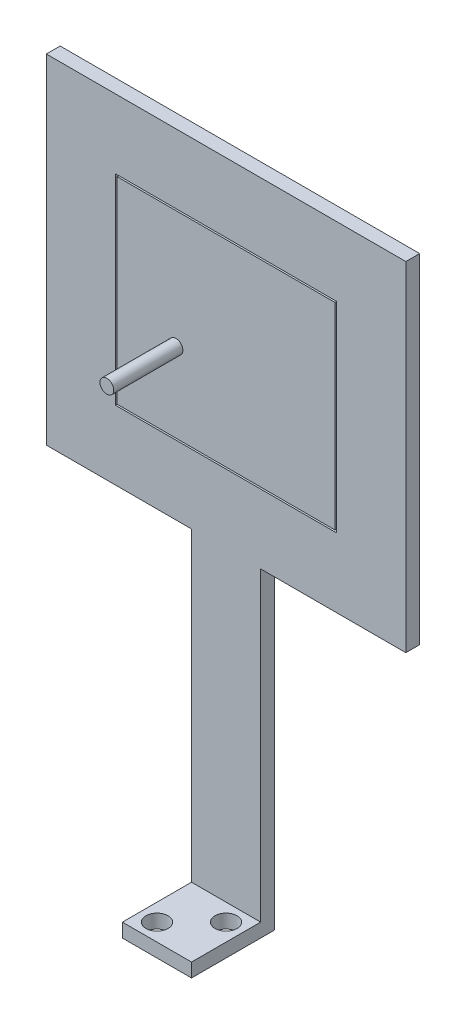
ISO-10303-21;
HEADER;
FILE_DESCRIPTION(('STEP AP214'),'2;1');
FILE_NAME('part.step','',(''),(''),'','','');
FILE_SCHEMA(('AUTOMOTIVE_DESIGN { 1 0 10303 214 1 1 1 1 }'));
ENDSEC;
DATA;
#1=APPLICATION_CONTEXT('core data for automotive mechanical design processes');
#2=APPLICATION_PROTOCOL_DEFINITION('international standard','automotive_design',2000,#1);
#3=PRODUCT_CONTEXT('',#1,'mechanical');
#4=PRODUCT('Part','Part','',(#3));
#5=PRODUCT_RELATED_PRODUCT_CATEGORY('part','',(#4));
#6=PRODUCT_DEFINITION_FORMATION('','',#4);
#7=PRODUCT_DEFINITION_CONTEXT('part definition',#1,'design');
#8=PRODUCT_DEFINITION('design','',#6,#7);
#9=PRODUCT_DEFINITION_SHAPE('','',#8);
#10=(LENGTH_UNIT() NAMED_UNIT(*) SI_UNIT(.MILLI.,.METRE.));
#11=(NAMED_UNIT(*) PLANE_ANGLE_UNIT() SI_UNIT($,.RADIAN.));
#12=(NAMED_UNIT(*) SI_UNIT($,.STERADIAN.) SOLID_ANGLE_UNIT());
#13=UNCERTAINTY_MEASURE_WITH_UNIT(LENGTH_MEASURE(1.E-05),#10,'distance_accuracy_value','');
#14=(GEOMETRIC_REPRESENTATION_CONTEXT(3) GLOBAL_UNCERTAINTY_ASSIGNED_CONTEXT((#13)) GLOBAL_UNIT_ASSIGNED_CONTEXT((#10,
#11,#12)) REPRESENTATION_CONTEXT('',''));
#15=CARTESIAN_POINT('',(0.,0.,0.));
#16=DIRECTION('',(0.,0.,1.));
#17=DIRECTION('',(1.,0.,0.));
#18=AXIS2_PLACEMENT_3D('',#15,#16,#17);
#19=CARTESIAN_POINT('',(0.,-38.75,-0.5));
#20=DIRECTION('',(0.,-1.,0.));
#21=DIRECTION('',(0.,0.,-1.));
#22=AXIS2_PLACEMENT_3D('',#19,#20,#21);
#23=PLANE('',#22);
#24=DIRECTION('',(0.,0.,-1.));
#25=VECTOR('',#24,1.);
#26=CARTESIAN_POINT('',(10.75,-38.75,1.5));
#27=LINE('',#26,#25);
#28=CARTESIAN_POINT('',(10.75,-38.75,1.5));
#29=VERTEX_POINT('',#28);
#30=CARTESIAN_POINT('',(10.75,-38.75,-0.5));
#31=VERTEX_POINT('',#30);
#32=EDGE_CURVE('E188',#29,#31,#27,.T.);
#33=ORIENTED_EDGE('',*,*,#32,.F.);
#34=DIRECTION('',(1.,0.,0.));
#35=VECTOR('',#34,1.);
#36=CARTESIAN_POINT('',(0.,-38.75,1.5));
#37=LINE('',#36,#35);
#38=CARTESIAN_POINT('',(-10.25,-38.75,1.5));
#39=VERTEX_POINT('',#38);
#40=EDGE_CURVE('E296',#39,#29,#37,.T.);
#41=ORIENTED_EDGE('',*,*,#40,.F.);
#42=DIRECTION('',(0.,0.,1.));
#43=VECTOR('',#42,1.);
#44=CARTESIAN_POINT('',(-10.25,-38.75,-0.5));
#45=LINE('',#44,#43);
#46=CARTESIAN_POINT('',(-10.25,-38.75,-0.5));
#47=VERTEX_POINT('',#46);
#48=EDGE_CURVE('E328',#47,#39,#45,.T.);
#49=ORIENTED_EDGE('',*,*,#48,.F.);
#50=DIRECTION('',(1.,0.,0.));
#51=VECTOR('',#50,1.);
#52=CARTESIAN_POINT('',(0.,-38.75,-0.5));
#53=LINE('',#52,#51);
#54=EDGE_CURVE('E104',#47,#31,#53,.T.);
#55=ORIENTED_EDGE('',*,*,#54,.T.);
#56=EDGE_LOOP('',(#33,#41,#49,#55));
#57=FACE_BOUND('',#56,.T.);
#58=ADVANCED_FACE('F78',(#57),#23,.T.);
#59=CARTESIAN_POINT('',(0.,0.25,-0.5));
#60=DIRECTION('',(0.,-1.,0.));
#61=DIRECTION('',(0.,0.,-1.));
#62=AXIS2_PLACEMENT_3D('',#59,#60,#61);
#63=PLANE('',#62);
#64=DIRECTION('',(1.,0.,0.));
#65=VECTOR('',#64,1.);
#66=CARTESIAN_POINT('',(0.,0.25,1.5));
#67=LINE('',#66,#65);
#68=CARTESIAN_POINT('',(-0.25,0.25,1.5));
#69=VERTEX_POINT('',#68);
#70=CARTESIAN_POINT('',(31.75,0.25,1.5));
#71=VERTEX_POINT('',#70);
#72=EDGE_CURVE('E300',#69,#71,#67,.T.);
#73=ORIENTED_EDGE('',*,*,#72,.F.);
#74=DIRECTION('',(0.,0.,1.));
#75=VECTOR('',#74,1.);
#76=CARTESIAN_POINT('',(-0.25,0.25,-0.5));
#77=LINE('',#76,#75);
#78=CARTESIAN_POINT('',(-0.25,0.25,-0.5));
#79=VERTEX_POINT('',#78);
#80=EDGE_CURVE('E13',#79,#69,#77,.T.);
#81=ORIENTED_EDGE('',*,*,#80,.F.);
#82=DIRECTION('',(1.,0.,0.));
#83=VECTOR('',#82,1.);
#84=CARTESIAN_POINT('',(0.,0.25,-0.5));
#85=LINE('',#84,#83);
#86=CARTESIAN_POINT('',(31.75,0.25,-0.5));
#87=VERTEX_POINT('',#86);
#88=EDGE_CURVE('E270',#79,#87,#85,.T.);
#89=ORIENTED_EDGE('',*,*,#88,.T.);
#90=DIRECTION('',(0.,0.,1.));
#91=VECTOR('',#90,1.);
#92=CARTESIAN_POINT('',(31.75,0.25,-0.5));
#93=LINE('',#92,#91);
#94=EDGE_CURVE('E321',#87,#71,#93,.T.);
#95=ORIENTED_EDGE('',*,*,#94,.T.);
#96=EDGE_LOOP('',(#73,#81,#89,#95));
#97=FACE_BOUND('',#96,.T.);
#98=ADVANCED_FACE('F365',(#97),#63,.T.);
#99=CARTESIAN_POINT('',(-0.25,0.,-0.5));
#100=DIRECTION('',(-1.,0.,0.));
#101=DIRECTION('',(0.,-1.,0.));
#102=AXIS2_PLACEMENT_3D('',#99,#100,#101);
#103=PLANE('',#102);
#104=DIRECTION('',(0.,-1.,0.));
#105=VECTOR('',#104,1.);
#106=CARTESIAN_POINT('',(-0.25,0.,1.5));
#107=LINE('',#106,#105);
#108=CARTESIAN_POINT('',(-0.249999999999996,-28.75,1.5));
#109=VERTEX_POINT('',#108);
#110=EDGE_CURVE('E260',#69,#109,#107,.T.);
#111=ORIENTED_EDGE('',*,*,#110,.T.);
#112=DIRECTION('',(0.,0.,1.));
#113=VECTOR('',#112,1.);
#114=CARTESIAN_POINT('',(-0.249999999999996,-28.75,-0.5));
#115=LINE('',#114,#113);
#116=CARTESIAN_POINT('',(-0.249999999999996,-28.75,-0.5));
#117=VERTEX_POINT('',#116);
#118=EDGE_CURVE('E88',#117,#109,#115,.T.);
#119=ORIENTED_EDGE('',*,*,#118,.F.);
#120=DIRECTION('',(0.,-1.,0.));
#121=VECTOR('',#120,1.);
#122=CARTESIAN_POINT('',(-0.25,0.,-0.5));
#123=LINE('',#122,#121);
#124=EDGE_CURVE('E281',#79,#117,#123,.T.);
#125=ORIENTED_EDGE('',*,*,#124,.F.);
#126=ORIENTED_EDGE('',*,*,#80,.T.);
#127=EDGE_LOOP('',(#111,#119,#125,#126));
#128=FACE_BOUND('',#127,.T.);
#129=ADVANCED_FACE('F369',(#128),#103,.F.);
#130=CARTESIAN_POINT('',(0.,-28.75,-0.5));
#131=DIRECTION('',(0.,-1.,0.));
#132=DIRECTION('',(0.,0.,-1.));
#133=AXIS2_PLACEMENT_3D('',#130,#131,#132);
#134=PLANE('',#133);
#135=DIRECTION('',(1.,0.,0.));
#136=VECTOR('',#135,1.);
#137=CARTESIAN_POINT('',(0.,-28.75,1.5));
#138=LINE('',#137,#136);
#139=CARTESIAN_POINT('',(31.75,-28.75,1.5));
#140=VERTEX_POINT('',#139);
#141=EDGE_CURVE('E308',#109,#140,#138,.T.);
#142=ORIENTED_EDGE('',*,*,#141,.T.);
#143=DIRECTION('',(0.,0.,1.));
#144=VECTOR('',#143,1.);
#145=CARTESIAN_POINT('',(31.75,-28.75,-0.5));
#146=LINE('',#145,#144);
#147=CARTESIAN_POINT('',(31.75,-28.75,-0.5));
#148=VERTEX_POINT('',#147);
#149=EDGE_CURVE('E318',#148,#140,#146,.T.);
#150=ORIENTED_EDGE('',*,*,#149,.F.);
#151=DIRECTION('',(1.,0.,0.));
#152=VECTOR('',#151,1.);
#153=CARTESIAN_POINT('',(0.,-28.75,-0.5));
#154=LINE('',#153,#152);
#155=EDGE_CURVE('E278',#117,#148,#154,.T.);
#156=ORIENTED_EDGE('',*,*,#155,.F.);
#157=ORIENTED_EDGE('',*,*,#118,.T.);
#158=EDGE_LOOP('',(#142,#150,#156,#157));
#159=FACE_BOUND('',#158,.T.);
#160=ADVANCED_FACE('F375',(#159),#134,.F.);
#161=CARTESIAN_POINT('',(41.75,0.,-0.5));
#162=DIRECTION('',(-1.,0.,0.));
#163=DIRECTION('',(0.,-1.,0.));
#164=AXIS2_PLACEMENT_3D('',#161,#162,#163);
#165=PLANE('',#164);
#166=DIRECTION('',(0.,-1.,0.));
#167=VECTOR('',#166,1.);
#168=CARTESIAN_POINT('',(41.75,0.,1.5));
#169=LINE('',#168,#167);
#170=CARTESIAN_POINT('',(41.75,10.25,1.5));
#171=VERTEX_POINT('',#170);
#172=CARTESIAN_POINT('',(41.75,-38.75,1.5));
#173=VERTEX_POINT('',#172);
#174=EDGE_CURVE('E191',#171,#173,#169,.T.);
#175=ORIENTED_EDGE('',*,*,#174,.T.);
#176=DIRECTION('',(0.,0.,1.));
#177=VECTOR('',#176,1.);
#178=CARTESIAN_POINT('',(41.75,-38.75,-0.5));
#179=LINE('',#178,#177);
#180=CARTESIAN_POINT('',(41.75,-38.75,-0.5));
#181=VERTEX_POINT('',#180);
#182=EDGE_CURVE('E324',#181,#173,#179,.T.);
#183=ORIENTED_EDGE('',*,*,#182,.F.);
#184=DIRECTION('',(0.,-1.,0.));
#185=VECTOR('',#184,1.);
#186=CARTESIAN_POINT('',(41.75,0.,-0.5));
#187=LINE('',#186,#185);
#188=CARTESIAN_POINT('',(41.75,10.25,-0.5));
#189=VERTEX_POINT('',#188);
#190=EDGE_CURVE('E256',#189,#181,#187,.T.);
#191=ORIENTED_EDGE('',*,*,#190,.F.);
#192=DIRECTION('',(0.,0.,1.));
#193=VECTOR('',#192,1.);
#194=CARTESIAN_POINT('',(41.75,10.25,-0.5));
#195=LINE('',#194,#193);
#196=EDGE_CURVE('E82',#189,#171,#195,.T.);
#197=ORIENTED_EDGE('',*,*,#196,.T.);
#198=EDGE_LOOP('',(#175,#183,#191,#197));
#199=FACE_BOUND('',#198,.T.);
#200=ADVANCED_FACE('F80',(#199),#165,.F.);
#201=DIRECTION('',(0.,0.,1.));
#202=VECTOR('',#201,1.);
#203=CARTESIAN_POINT('',(20.75,-38.75,1.5));
#204=LINE('',#203,#202);
#205=CARTESIAN_POINT('',(20.75,-38.75,-0.5));
#206=VERTEX_POINT('',#205);
#207=CARTESIAN_POINT('',(20.75,-38.75,1.5));
#208=VERTEX_POINT('',#207);
#209=EDGE_CURVE('E96',#206,#208,#204,.T.);
#210=ORIENTED_EDGE('',*,*,#209,.F.);
#211=EDGE_CURVE('E267',#206,#181,#53,.T.);
#212=ORIENTED_EDGE('',*,*,#211,.T.);
#213=ORIENTED_EDGE('',*,*,#182,.T.);
#214=EDGE_CURVE('E295',#208,#173,#37,.T.);
#215=ORIENTED_EDGE('',*,*,#214,.F.);
#216=EDGE_LOOP('',(#210,#212,#213,#215));
#217=FACE_BOUND('',#216,.T.);
#218=ADVANCED_FACE('F350',(#217),#23,.T.);
#219=CARTESIAN_POINT('',(-10.25,0.,-0.5));
#220=DIRECTION('',(-1.,0.,0.));
#221=DIRECTION('',(0.,-1.,0.));
#222=AXIS2_PLACEMENT_3D('',#219,#220,#221);
#223=PLANE('',#222);
#224=DIRECTION('',(0.,-1.,0.));
#225=VECTOR('',#224,1.);
#226=CARTESIAN_POINT('',(-10.25,0.,1.5));
#227=LINE('',#226,#225);
#228=CARTESIAN_POINT('',(-10.25,10.25,1.5));
#229=VERTEX_POINT('',#228);
#230=EDGE_CURVE('E291',#229,#39,#227,.T.);
#231=ORIENTED_EDGE('',*,*,#230,.F.);
#232=DIRECTION('',(0.,0.,1.));
#233=VECTOR('',#232,1.);
#234=CARTESIAN_POINT('',(-10.25,10.25,-0.5));
#235=LINE('',#234,#233);
#236=CARTESIAN_POINT('',(-10.25,10.25,-0.5));
#237=VERTEX_POINT('',#236);
#238=EDGE_CURVE('E330',#237,#229,#235,.T.);
#239=ORIENTED_EDGE('',*,*,#238,.F.);
#240=DIRECTION('',(0.,-1.,0.));
#241=VECTOR('',#240,1.);
#242=CARTESIAN_POINT('',(-10.25,0.,-0.5));
#243=LINE('',#242,#241);
#244=EDGE_CURVE('E263',#237,#47,#243,.T.);
#245=ORIENTED_EDGE('',*,*,#244,.T.);
#246=ORIENTED_EDGE('',*,*,#48,.T.);
#247=EDGE_LOOP('',(#231,#239,#245,#246));
#248=FACE_BOUND('',#247,.T.);
#249=ADVANCED_FACE('F356',(#248),#223,.T.);
#250=CARTESIAN_POINT('',(0.,10.25,-0.5));
#251=DIRECTION('',(0.,-1.,0.));
#252=DIRECTION('',(0.,0.,-1.));
#253=AXIS2_PLACEMENT_3D('',#250,#251,#252);
#254=PLANE('',#253);
#255=DIRECTION('',(1.,0.,0.));
#256=VECTOR('',#255,1.);
#257=CARTESIAN_POINT('',(0.,10.25,1.5));
#258=LINE('',#257,#256);
#259=EDGE_CURVE('E288',#229,#171,#258,.T.);
#260=ORIENTED_EDGE('',*,*,#259,.T.);
#261=ORIENTED_EDGE('',*,*,#196,.F.);
#262=DIRECTION('',(1.,0.,0.));
#263=VECTOR('',#262,1.);
#264=CARTESIAN_POINT('',(0.,10.25,-0.5));
#265=LINE('',#264,#263);
#266=EDGE_CURVE('E259',#237,#189,#265,.T.);
#267=ORIENTED_EDGE('',*,*,#266,.F.);
#268=ORIENTED_EDGE('',*,*,#238,.T.);
#269=EDGE_LOOP('',(#260,#261,#267,#268));
#270=FACE_BOUND('',#269,.T.);
#271=ADVANCED_FACE('F353',(#270),#254,.F.);
#272=CARTESIAN_POINT('',(31.75,0.,-0.5));
#273=DIRECTION('',(-1.,0.,0.));
#274=DIRECTION('',(0.,-1.,0.));
#275=AXIS2_PLACEMENT_3D('',#272,#273,#274);
#276=PLANE('',#275);
#277=DIRECTION('',(0.,-1.,0.));
#278=VECTOR('',#277,1.);
#279=CARTESIAN_POINT('',(31.75,0.,1.5));
#280=LINE('',#279,#278);
#281=EDGE_CURVE('E304',#71,#140,#280,.T.);
#282=ORIENTED_EDGE('',*,*,#281,.F.);
#283=ORIENTED_EDGE('',*,*,#94,.F.);
#284=DIRECTION('',(0.,-1.,0.));
#285=VECTOR('',#284,1.);
#286=CARTESIAN_POINT('',(31.75,0.,-0.5));
#287=LINE('',#286,#285);
#288=EDGE_CURVE('E274',#87,#148,#287,.T.);
#289=ORIENTED_EDGE('',*,*,#288,.T.);
#290=ORIENTED_EDGE('',*,*,#149,.T.);
#291=EDGE_LOOP('',(#282,#283,#289,#290));
#292=FACE_BOUND('',#291,.T.);
#293=ADVANCED_FACE('F355',(#292),#276,.T.);
#294=CARTESIAN_POINT('',(0.,0.,-0.5));
#295=DIRECTION('',(0.,0.,1.));
#296=DIRECTION('',(1.,0.,0.));
#297=AXIS2_PLACEMENT_3D('',#294,#295,#296);
#298=PLANE('',#297);
#299=ORIENTED_EDGE('',*,*,#190,.T.);
#300=ORIENTED_EDGE('',*,*,#211,.F.);
#301=DIRECTION('',(0.,1.,0.));
#302=VECTOR('',#301,1.);
#303=CARTESIAN_POINT('',(20.75,-83.,-0.5));
#304=LINE('',#303,#302);
#305=CARTESIAN_POINT('',(20.75,-85.,-0.5));
#306=VERTEX_POINT('',#305);
#307=EDGE_CURVE('E192',#306,#206,#304,.T.);
#308=ORIENTED_EDGE('',*,*,#307,.F.);
#309=DIRECTION('',(1.,0.,0.));
#310=VECTOR('',#309,1.);
#311=CARTESIAN_POINT('',(10.75,-85.,-0.5));
#312=LINE('',#311,#310);
#313=CARTESIAN_POINT('',(10.75,-85.,-0.5));
#314=VERTEX_POINT('',#313);
#315=EDGE_CURVE('E195',#314,#306,#312,.T.);
#316=ORIENTED_EDGE('',*,*,#315,.F.);
#317=DIRECTION('',(0.,1.,0.));
#318=VECTOR('',#317,1.);
#319=CARTESIAN_POINT('',(10.75,-83.,-0.5));
#320=LINE('',#319,#318);
#321=EDGE_CURVE('E181',#314,#31,#320,.T.);
#322=ORIENTED_EDGE('',*,*,#321,.T.);
#323=ORIENTED_EDGE('',*,*,#54,.F.);
#324=ORIENTED_EDGE('',*,*,#244,.F.);
#325=ORIENTED_EDGE('',*,*,#266,.T.);
#326=EDGE_LOOP('',(#299,#300,#308,#316,#322,#323,#324,#325));
#327=FACE_BOUND('',#326,.T.);
#328=ORIENTED_EDGE('',*,*,#88,.F.);
#329=ORIENTED_EDGE('',*,*,#124,.T.);
#330=ORIENTED_EDGE('',*,*,#155,.T.);
#331=ORIENTED_EDGE('',*,*,#288,.F.);
#332=EDGE_LOOP('',(#328,#329,#330,#331));
#333=FACE_BOUND('',#332,.T.);
#334=ADVANCED_FACE('F197',(#327,#333),#298,.F.);
#335=CARTESIAN_POINT('',(0.,0.,1.5));
#336=DIRECTION('',(0.,0.,1.));
#337=DIRECTION('',(1.,0.,0.));
#338=AXIS2_PLACEMENT_3D('',#335,#336,#337);
#339=PLANE('',#338);
#340=ORIENTED_EDGE('',*,*,#174,.F.);
#341=ORIENTED_EDGE('',*,*,#259,.F.);
#342=ORIENTED_EDGE('',*,*,#230,.T.);
#343=ORIENTED_EDGE('',*,*,#40,.T.);
#344=DIRECTION('',(0.,1.,0.));
#345=VECTOR('',#344,1.);
#346=CARTESIAN_POINT('',(10.75,-83.,1.5));
#347=LINE('',#346,#345);
#348=CARTESIAN_POINT('',(10.75,-83.,1.5));
#349=VERTEX_POINT('',#348);
#350=EDGE_CURVE('E243',#349,#29,#347,.T.);
#351=ORIENTED_EDGE('',*,*,#350,.F.);
#352=DIRECTION('',(-1.,0.,0.));
#353=VECTOR('',#352,1.);
#354=CARTESIAN_POINT('',(10.75,-83.,1.5));
#355=LINE('',#354,#353);
#356=CARTESIAN_POINT('',(20.75,-83.,1.5));
#357=VERTEX_POINT('',#356);
#358=EDGE_CURVE('E239',#357,#349,#355,.T.);
#359=ORIENTED_EDGE('',*,*,#358,.F.);
#360=DIRECTION('',(0.,1.,0.));
#361=VECTOR('',#360,1.);
#362=CARTESIAN_POINT('',(20.75,-83.,1.5));
#363=LINE('',#362,#361);
#364=EDGE_CURVE('E250',#357,#208,#363,.T.);
#365=ORIENTED_EDGE('',*,*,#364,.T.);
#366=ORIENTED_EDGE('',*,*,#214,.T.);
#367=EDGE_LOOP('',(#340,#341,#342,#343,#351,#359,#365,#366));
#368=FACE_BOUND('',#367,.T.);
#369=ORIENTED_EDGE('',*,*,#72,.T.);
#370=ORIENTED_EDGE('',*,*,#281,.T.);
#371=ORIENTED_EDGE('',*,*,#141,.F.);
#372=ORIENTED_EDGE('',*,*,#110,.F.);
#373=EDGE_LOOP('',(#369,#370,#371,#372));
#374=FACE_BOUND('',#373,.T.);
#375=ADVANCED_FACE('F345',(#368,#374),#339,.T.);
#376=CARTESIAN_POINT('',(10.75,-83.,1.5));
#377=DIRECTION('',(1.,0.,0.));
#378=DIRECTION('',(0.,0.,-1.));
#379=AXIS2_PLACEMENT_3D('',#376,#377,#378);
#380=PLANE('',#379);
#381=ORIENTED_EDGE('',*,*,#32,.T.);
#382=ORIENTED_EDGE('',*,*,#321,.F.);
#383=DIRECTION('',(0.,0.,-1.));
#384=VECTOR('',#383,1.);
#385=CARTESIAN_POINT('',(10.75,-85.,-0.5));
#386=LINE('',#385,#384);
#387=CARTESIAN_POINT('',(10.75,-85.,11.5));
#388=VERTEX_POINT('',#387);
#389=EDGE_CURVE('E186',#388,#314,#386,.T.);
#390=ORIENTED_EDGE('',*,*,#389,.F.);
#391=DIRECTION('',(0.,1.,0.));
#392=VECTOR('',#391,1.);
#393=CARTESIAN_POINT('',(10.75,-85.,11.5));
#394=LINE('',#393,#392);
#395=CARTESIAN_POINT('',(10.75,-83.,11.5));
#396=VERTEX_POINT('',#395);
#397=EDGE_CURVE('E226',#388,#396,#394,.T.);
#398=ORIENTED_EDGE('',*,*,#397,.T.);
#399=DIRECTION('',(0.,0.,-1.));
#400=VECTOR('',#399,1.);
#401=CARTESIAN_POINT('',(10.75,-83.,-0.5));
#402=LINE('',#401,#400);
#403=EDGE_CURVE('E227',#396,#349,#402,.T.);
#404=ORIENTED_EDGE('',*,*,#403,.T.);
#405=ORIENTED_EDGE('',*,*,#350,.T.);
#406=EDGE_LOOP('',(#381,#382,#390,#398,#404,#405));
#407=FACE_BOUND('',#406,.T.);
#408=ADVANCED_FACE('F183',(#407),#380,.F.);
#409=CARTESIAN_POINT('',(20.75,-83.,1.5));
#410=DIRECTION('',(-1.,0.,0.));
#411=DIRECTION('',(0.,0.,1.));
#412=AXIS2_PLACEMENT_3D('',#409,#410,#411);
#413=PLANE('',#412);
#414=ORIENTED_EDGE('',*,*,#209,.T.);
#415=ORIENTED_EDGE('',*,*,#364,.F.);
#416=DIRECTION('',(0.,0.,1.));
#417=VECTOR('',#416,1.);
#418=CARTESIAN_POINT('',(20.75,-83.,-0.5));
#419=LINE('',#418,#417);
#420=CARTESIAN_POINT('',(20.75,-83.,11.5));
#421=VERTEX_POINT('',#420);
#422=EDGE_CURVE('E216',#357,#421,#419,.T.);
#423=ORIENTED_EDGE('',*,*,#422,.T.);
#424=DIRECTION('',(0.,1.,0.));
#425=VECTOR('',#424,1.);
#426=CARTESIAN_POINT('',(20.75,-85.,11.5));
#427=LINE('',#426,#425);
#428=CARTESIAN_POINT('',(20.75,-85.,11.5));
#429=VERTEX_POINT('',#428);
#430=EDGE_CURVE('E236',#429,#421,#427,.T.);
#431=ORIENTED_EDGE('',*,*,#430,.F.);
#432=DIRECTION('',(0.,0.,1.));
#433=VECTOR('',#432,1.);
#434=CARTESIAN_POINT('',(20.75,-85.,-0.5));
#435=LINE('',#434,#433);
#436=EDGE_CURVE('E203',#306,#429,#435,.T.);
#437=ORIENTED_EDGE('',*,*,#436,.F.);
#438=ORIENTED_EDGE('',*,*,#307,.T.);
#439=EDGE_LOOP('',(#414,#415,#423,#431,#437,#438));
#440=FACE_BOUND('',#439,.T.);
#441=ADVANCED_FACE('F391',(#440),#413,.F.);
#442=CARTESIAN_POINT('',(0.,-85.,0.));
#443=DIRECTION('',(0.,1.,0.));
#444=DIRECTION('',(0.,0.,1.));
#445=AXIS2_PLACEMENT_3D('',#442,#443,#444);
#446=PLANE('',#445);
#447=ORIENTED_EDGE('',*,*,#389,.T.);
#448=ORIENTED_EDGE('',*,*,#315,.T.);
#449=ORIENTED_EDGE('',*,*,#436,.T.);
#450=DIRECTION('',(-1.,0.,0.));
#451=VECTOR('',#450,1.);
#452=CARTESIAN_POINT('',(10.75,-85.,11.5));
#453=LINE('',#452,#451);
#454=EDGE_CURVE('E208',#429,#388,#453,.T.);
#455=ORIENTED_EDGE('',*,*,#454,.T.);
#456=EDGE_LOOP('',(#447,#448,#449,#455));
#457=FACE_BOUND('',#456,.T.);
#458=CARTESIAN_POINT('',(13.2531580054004,-85.,8.99684199459962));
#459=DIRECTION('',(0.,-1.,0.));
#460=DIRECTION('',(0.,0.,-1.));
#461=AXIS2_PLACEMENT_3D('',#458,#459,#460);
#462=CIRCLE('',#461,1.6);
#463=CARTESIAN_POINT('',(13.2531580054004,-85.,7.39684199459962));
#464=VERTEX_POINT('',#463);
#465=EDGE_CURVE('E231',#464,#464,#462,.T.);
#466=ORIENTED_EDGE('',*,*,#465,.F.);
#467=EDGE_LOOP('',(#466));
#468=FACE_BOUND('',#467,.T.);
#469=CARTESIAN_POINT('',(18.2468419945996,-85.,4.00315800540038));
#470=DIRECTION('',(0.,-1.,0.));
#471=DIRECTION('',(0.,0.,-1.));
#472=AXIS2_PLACEMENT_3D('',#469,#470,#471);
#473=CIRCLE('',#472,1.6);
#474=CARTESIAN_POINT('',(18.2468419945996,-85.,2.40315800540038));
#475=VERTEX_POINT('',#474);
#476=EDGE_CURVE('E416',#475,#475,#473,.T.);
#477=ORIENTED_EDGE('',*,*,#476,.F.);
#478=EDGE_LOOP('',(#477));
#479=FACE_BOUND('',#478,.T.);
#480=ADVANCED_FACE('F205',(#457,#468,#479),#446,.F.);
#481=CARTESIAN_POINT('',(0.,-83.,0.));
#482=DIRECTION('',(0.,1.,0.));
#483=DIRECTION('',(0.,0.,1.));
#484=AXIS2_PLACEMENT_3D('',#481,#482,#483);
#485=PLANE('',#484);
#486=CARTESIAN_POINT('',(13.2531580054004,-83.,8.99684199459962));
#487=DIRECTION('',(0.,-1.,0.));
#488=DIRECTION('',(0.,0.,-1.));
#489=AXIS2_PLACEMENT_3D('',#486,#487,#488);
#490=CIRCLE('',#489,1.6);
#491=CARTESIAN_POINT('',(13.2531580054004,-83.,7.39684199459962));
#492=VERTEX_POINT('',#491);
#493=EDGE_CURVE('E219',#492,#492,#490,.T.);
#494=ORIENTED_EDGE('',*,*,#493,.T.);
#495=EDGE_LOOP('',(#494));
#496=FACE_BOUND('',#495,.T.);
#497=ORIENTED_EDGE('',*,*,#422,.F.);
#498=ORIENTED_EDGE('',*,*,#358,.T.);
#499=ORIENTED_EDGE('',*,*,#403,.F.);
#500=DIRECTION('',(-1.,0.,0.));
#501=VECTOR('',#500,1.);
#502=CARTESIAN_POINT('',(10.75,-83.,11.5));
#503=LINE('',#502,#501);
#504=EDGE_CURVE('E211',#421,#396,#503,.T.);
#505=ORIENTED_EDGE('',*,*,#504,.F.);
#506=EDGE_LOOP('',(#497,#498,#499,#505));
#507=FACE_BOUND('',#506,.T.);
#508=CARTESIAN_POINT('',(18.2468419945996,-83.,4.00315800540038));
#509=DIRECTION('',(0.,-1.,0.));
#510=DIRECTION('',(0.,0.,-1.));
#511=AXIS2_PLACEMENT_3D('',#508,#509,#510);
#512=CIRCLE('',#511,1.6);
#513=CARTESIAN_POINT('',(18.2468419945996,-83.,2.40315800540038));
#514=VERTEX_POINT('',#513);
#515=EDGE_CURVE('E419',#514,#514,#512,.T.);
#516=ORIENTED_EDGE('',*,*,#515,.T.);
#517=EDGE_LOOP('',(#516));
#518=FACE_BOUND('',#517,.T.);
#519=ADVANCED_FACE('F399',(#496,#507,#518),#485,.T.);
#520=CARTESIAN_POINT('',(10.75,-85.,11.5));
#521=DIRECTION('',(0.,0.,-1.));
#522=DIRECTION('',(-1.,0.,0.));
#523=AXIS2_PLACEMENT_3D('',#520,#521,#522);
#524=PLANE('',#523);
#525=ORIENTED_EDGE('',*,*,#504,.T.);
#526=ORIENTED_EDGE('',*,*,#397,.F.);
#527=ORIENTED_EDGE('',*,*,#454,.F.);
#528=ORIENTED_EDGE('',*,*,#430,.T.);
#529=EDGE_LOOP('',(#525,#526,#527,#528));
#530=FACE_BOUND('',#529,.T.);
#531=ADVANCED_FACE('F395',(#530),#524,.F.);
#532=CARTESIAN_POINT('',(13.2531580054004,-85.,8.99684199459962));
#533=DIRECTION('',(0.,1.,0.));
#534=DIRECTION('',(0.,0.,1.));
#535=AXIS2_PLACEMENT_3D('',#532,#533,#534);
#536=CYLINDRICAL_SURFACE('',#535,1.6);
#537=ORIENTED_EDGE('',*,*,#465,.T.);
#538=EDGE_LOOP('',(#537));
#539=FACE_BOUND('',#538,.T.);
#540=ORIENTED_EDGE('',*,*,#493,.F.);
#541=EDGE_LOOP('',(#540));
#542=FACE_BOUND('',#541,.T.);
#543=ADVANCED_FACE('F398',(#539,#542),#536,.F.);
#544=CARTESIAN_POINT('',(18.2468419945996,-85.,4.00315800540038));
#545=DIRECTION('',(0.,1.,0.));
#546=DIRECTION('',(0.,0.,1.));
#547=AXIS2_PLACEMENT_3D('',#544,#545,#546);
#548=CYLINDRICAL_SURFACE('',#547,1.6);
#549=ORIENTED_EDGE('',*,*,#476,.T.);
#550=EDGE_LOOP('',(#549));
#551=FACE_BOUND('',#550,.T.);
#552=ORIENTED_EDGE('',*,*,#515,.F.);
#553=EDGE_LOOP('',(#552));
#554=FACE_BOUND('',#553,.T.);
#555=ADVANCED_FACE('F408',(#551,#554),#548,.F.);
#556=CLOSED_SHELL('',(#58,#98,#129,#160,#200,#218,#249,#271,#293,#334,#375,#408,#441,#480,#519,
#531,#543,#555));
#557=MANIFOLD_SOLID_BREP('B2',#556);
#558=CARTESIAN_POINT('',(0.,0.,1.5));
#559=DIRECTION('',(1.,0.,0.));
#560=DIRECTION('',(0.,0.,-1.));
#561=AXIS2_PLACEMENT_3D('',#558,#559,#560);
#562=PLANE('',#561);
#563=DIRECTION('',(0.,-1.,0.));
#564=VECTOR('',#563,1.);
#565=CARTESIAN_POINT('',(0.,0.,0.));
#566=LINE('',#565,#564);
#567=CARTESIAN_POINT('',(0.,0.,0.));
#568=VERTEX_POINT('',#567);
#569=CARTESIAN_POINT('',(0.,-28.5,0.));
#570=VERTEX_POINT('',#569);
#571=EDGE_CURVE('E687',#568,#570,#566,.T.);
#572=ORIENTED_EDGE('',*,*,#571,.T.);
#573=DIRECTION('',(0.,0.,-1.));
#574=VECTOR('',#573,1.);
#575=CARTESIAN_POINT('',(0.,-28.5,1.5));
#576=LINE('',#575,#574);
#577=CARTESIAN_POINT('',(0.,-28.5,1.5));
#578=VERTEX_POINT('',#577);
#579=EDGE_CURVE('E637',#578,#570,#576,.T.);
#580=ORIENTED_EDGE('',*,*,#579,.F.);
#581=DIRECTION('',(0.,-1.,0.));
#582=VECTOR('',#581,1.);
#583=CARTESIAN_POINT('',(0.,0.,1.5));
#584=LINE('',#583,#582);
#585=CARTESIAN_POINT('',(0.,0.,1.5));
#586=VERTEX_POINT('',#585);
#587=EDGE_CURVE('E679',#586,#578,#584,.T.);
#588=ORIENTED_EDGE('',*,*,#587,.F.);
#589=DIRECTION('',(0.,0.,-1.));
#590=VECTOR('',#589,1.);
#591=CARTESIAN_POINT('',(0.,0.,1.5));
#592=LINE('',#591,#590);
#593=EDGE_CURVE('E76',#586,#568,#592,.T.);
#594=ORIENTED_EDGE('',*,*,#593,.T.);
#595=EDGE_LOOP('',(#572,#580,#588,#594));
#596=FACE_BOUND('',#595,.T.);
#597=ADVANCED_FACE('F628',(#596),#562,.F.);
#598=CARTESIAN_POINT('',(0.,-28.5,1.5));
#599=DIRECTION('',(0.,1.,0.));
#600=DIRECTION('',(0.,0.,1.));
#601=AXIS2_PLACEMENT_3D('',#598,#599,#600);
#602=PLANE('',#601);
#603=DIRECTION('',(1.,0.,0.));
#604=VECTOR('',#603,1.);
#605=CARTESIAN_POINT('',(0.,-28.5,0.));
#606=LINE('',#605,#604);
#607=CARTESIAN_POINT('',(31.5,-28.5,0.));
#608=VERTEX_POINT('',#607);
#609=EDGE_CURVE('E694',#570,#608,#606,.T.);
#610=ORIENTED_EDGE('',*,*,#609,.T.);
#611=DIRECTION('',(0.,0.,-1.));
#612=VECTOR('',#611,1.);
#613=CARTESIAN_POINT('',(31.5,-28.5,1.5));
#614=LINE('',#613,#612);
#615=CARTESIAN_POINT('',(31.5,-28.5,1.5));
#616=VERTEX_POINT('',#615);
#617=EDGE_CURVE('E659',#616,#608,#614,.T.);
#618=ORIENTED_EDGE('',*,*,#617,.F.);
#619=DIRECTION('',(1.,0.,0.));
#620=VECTOR('',#619,1.);
#621=CARTESIAN_POINT('',(0.,-28.5,1.5));
#622=LINE('',#621,#620);
#623=EDGE_CURVE('E671',#578,#616,#622,.T.);
#624=ORIENTED_EDGE('',*,*,#623,.F.);
#625=ORIENTED_EDGE('',*,*,#579,.T.);
#626=EDGE_LOOP('',(#610,#618,#624,#625));
#627=FACE_BOUND('',#626,.T.);
#628=ADVANCED_FACE('F673',(#627),#602,.F.);
#629=CARTESIAN_POINT('',(31.5,0.,1.5));
#630=DIRECTION('',(1.,0.,0.));
#631=DIRECTION('',(0.,1.,0.));
#632=AXIS2_PLACEMENT_3D('',#629,#630,#631);
#633=PLANE('',#632);
#634=DIRECTION('',(0.,-1.,0.));
#635=VECTOR('',#634,1.);
#636=CARTESIAN_POINT('',(31.5,0.,0.));
#637=LINE('',#636,#635);
#638=CARTESIAN_POINT('',(31.5,0.,0.));
#639=VERTEX_POINT('',#638);
#640=EDGE_CURVE('E691',#639,#608,#637,.T.);
#641=ORIENTED_EDGE('',*,*,#640,.F.);
#642=DIRECTION('',(0.,0.,-1.));
#643=VECTOR('',#642,1.);
#644=CARTESIAN_POINT('',(31.5,0.,1.5));
#645=LINE('',#644,#643);
#646=CARTESIAN_POINT('',(31.5,0.,1.5));
#647=VERTEX_POINT('',#646);
#648=EDGE_CURVE('E645',#647,#639,#645,.T.);
#649=ORIENTED_EDGE('',*,*,#648,.F.);
#650=DIRECTION('',(0.,-1.,0.));
#651=VECTOR('',#650,1.);
#652=CARTESIAN_POINT('',(31.5,0.,1.5));
#653=LINE('',#652,#651);
#654=EDGE_CURVE('E678',#647,#616,#653,.T.);
#655=ORIENTED_EDGE('',*,*,#654,.T.);
#656=ORIENTED_EDGE('',*,*,#617,.T.);
#657=EDGE_LOOP('',(#641,#649,#655,#656));
#658=FACE_BOUND('',#657,.T.);
#659=ADVANCED_FACE('F728',(#658),#633,.T.);
#660=CARTESIAN_POINT('',(0.,0.,1.5));
#661=DIRECTION('',(0.,1.,0.));
#662=DIRECTION('',(0.,0.,1.));
#663=AXIS2_PLACEMENT_3D('',#660,#661,#662);
#664=PLANE('',#663);
#665=DIRECTION('',(1.,0.,0.));
#666=VECTOR('',#665,1.);
#667=CARTESIAN_POINT('',(0.,0.,0.));
#668=LINE('',#667,#666);
#669=EDGE_CURVE('E697',#568,#639,#668,.T.);
#670=ORIENTED_EDGE('',*,*,#669,.F.);
#671=ORIENTED_EDGE('',*,*,#593,.F.);
#672=DIRECTION('',(1.,0.,0.));
#673=VECTOR('',#672,1.);
#674=CARTESIAN_POINT('',(0.,0.,1.5));
#675=LINE('',#674,#673);
#676=EDGE_CURVE('E683',#586,#647,#675,.T.);
#677=ORIENTED_EDGE('',*,*,#676,.T.);
#678=ORIENTED_EDGE('',*,*,#648,.T.);
#679=EDGE_LOOP('',(#670,#671,#677,#678));
#680=FACE_BOUND('',#679,.T.);
#681=ADVANCED_FACE('F630',(#680),#664,.T.);
#682=CARTESIAN_POINT('',(0.,0.,0.));
#683=DIRECTION('',(0.,0.,1.));
#684=DIRECTION('',(1.,0.,0.));
#685=AXIS2_PLACEMENT_3D('',#682,#683,#684);
#686=PLANE('',#685);
#687=ORIENTED_EDGE('',*,*,#669,.T.);
#688=ORIENTED_EDGE('',*,*,#640,.T.);
#689=ORIENTED_EDGE('',*,*,#609,.F.);
#690=ORIENTED_EDGE('',*,*,#571,.F.);
#691=EDGE_LOOP('',(#687,#688,#689,#690));
#692=FACE_BOUND('',#691,.T.);
#693=ADVANCED_FACE('F717',(#692),#686,.F.);
#694=CARTESIAN_POINT('',(0.,0.,1.5));
#695=DIRECTION('',(0.,0.,1.));
#696=DIRECTION('',(1.,0.,0.));
#697=AXIS2_PLACEMENT_3D('',#694,#695,#696);
#698=PLANE('',#697);
#699=CARTESIAN_POINT('',(8.5,-17.,1.5));
#700=DIRECTION('',(0.,0.,1.));
#701=DIRECTION('',(1.,0.,0.));
#702=AXIS2_PLACEMENT_3D('',#699,#700,#701);
#703=CIRCLE('',#702,1.);
#704=CARTESIAN_POINT('',(9.5,-17.,1.5));
#705=VERTEX_POINT('',#704);
#706=EDGE_CURVE('E702',#705,#705,#703,.T.);
#707=ORIENTED_EDGE('',*,*,#706,.F.);
#708=EDGE_LOOP('',(#707));
#709=FACE_BOUND('',#708,.T.);
#710=ORIENTED_EDGE('',*,*,#676,.F.);
#711=ORIENTED_EDGE('',*,*,#587,.T.);
#712=ORIENTED_EDGE('',*,*,#623,.T.);
#713=ORIENTED_EDGE('',*,*,#654,.F.);
#714=EDGE_LOOP('',(#710,#711,#712,#713));
#715=FACE_BOUND('',#714,.T.);
#716=ADVANCED_FACE('F682',(#709,#715),#698,.T.);
#717=CARTESIAN_POINT('',(8.5,-17.,11.5));
#718=DIRECTION('',(0.,0.,-1.));
#719=DIRECTION('',(-1.,0.,0.));
#720=AXIS2_PLACEMENT_3D('',#717,#718,#719);
#721=CYLINDRICAL_SURFACE('',#720,1.);
#722=CARTESIAN_POINT('',(8.5,-17.,11.5));
#723=DIRECTION('',(0.,0.,1.));
#724=DIRECTION('',(1.,0.,0.));
#725=AXIS2_PLACEMENT_3D('',#722,#723,#724);
#726=CIRCLE('',#725,1.);
#727=CARTESIAN_POINT('',(9.5,-17.,11.5));
#728=VERTEX_POINT('',#727);
#729=EDGE_CURVE('E699',#728,#728,#726,.T.);
#730=ORIENTED_EDGE('',*,*,#729,.F.);
#731=EDGE_LOOP('',(#730));
#732=FACE_BOUND('',#731,.T.);
#733=ORIENTED_EDGE('',*,*,#706,.T.);
#734=EDGE_LOOP('',(#733));
#735=FACE_BOUND('',#734,.T.);
#736=ADVANCED_FACE('F710',(#732,#735),#721,.T.);
#737=CARTESIAN_POINT('',(0.,0.,11.5));
#738=DIRECTION('',(0.,0.,1.));
#739=DIRECTION('',(1.,0.,0.));
#740=AXIS2_PLACEMENT_3D('',#737,#738,#739);
#741=PLANE('',#740);
#742=ORIENTED_EDGE('',*,*,#729,.T.);
#743=EDGE_LOOP('',(#742));
#744=FACE_BOUND('',#743,.T.);
#745=ADVANCED_FACE('F708',(#744),#741,.T.);
#746=CLOSED_SHELL('',(#597,#628,#659,#681,#693,#716,#736,#745));
#747=MANIFOLD_SOLID_BREP('B7_NOT_SHOWN',#746);
#748=ADVANCED_BREP_SHAPE_REPRESENTATION('',(#18,#557,#747),#14);
#749=SHAPE_DEFINITION_REPRESENTATION(#9,#748);
ENDSEC;
END-ISO-10303-21;
